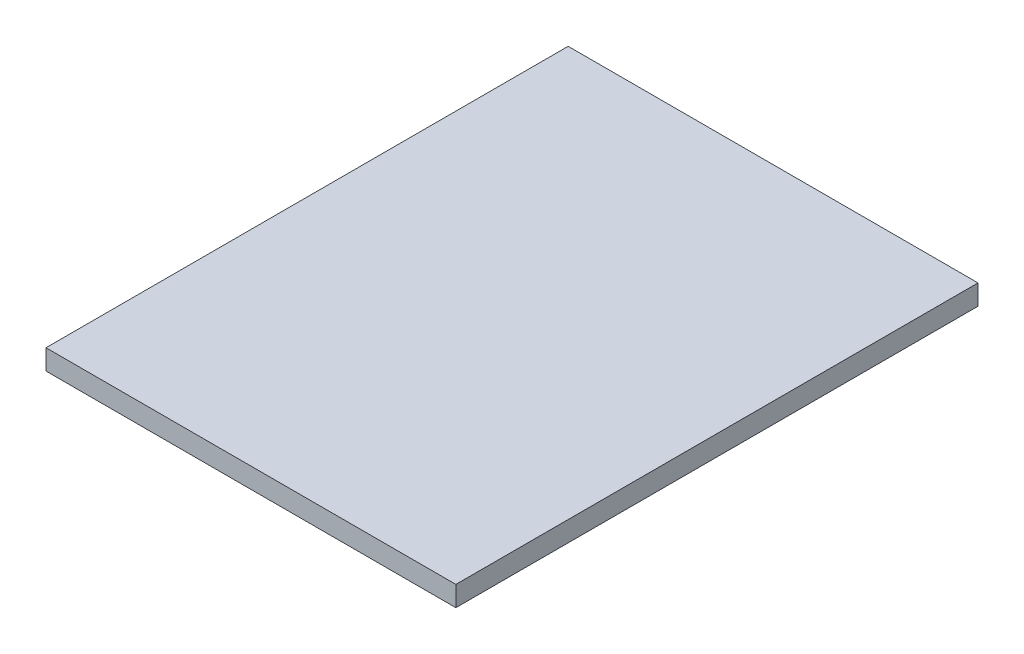
ISO-10303-21;
HEADER;
FILE_DESCRIPTION(('STEP AP214'),'2;1');
FILE_NAME('part.step','',(''),(''),'','','');
FILE_SCHEMA(('AUTOMOTIVE_DESIGN { 1 0 10303 214 1 1 1 1 }'));
ENDSEC;
DATA;
#1=APPLICATION_CONTEXT('core data for automotive mechanical design processes');
#2=APPLICATION_PROTOCOL_DEFINITION('international standard','automotive_design',2000,#1);
#3=PRODUCT_CONTEXT('',#1,'mechanical');
#4=PRODUCT('Part','Part','',(#3));
#5=PRODUCT_RELATED_PRODUCT_CATEGORY('part','',(#4));
#6=PRODUCT_DEFINITION_FORMATION('','',#4);
#7=PRODUCT_DEFINITION_CONTEXT('part definition',#1,'design');
#8=PRODUCT_DEFINITION('design','',#6,#7);
#9=PRODUCT_DEFINITION_SHAPE('','',#8);
#10=(LENGTH_UNIT() NAMED_UNIT(*) SI_UNIT(.MILLI.,.METRE.));
#11=(NAMED_UNIT(*) PLANE_ANGLE_UNIT() SI_UNIT($,.RADIAN.));
#12=(NAMED_UNIT(*) SI_UNIT($,.STERADIAN.) SOLID_ANGLE_UNIT());
#13=UNCERTAINTY_MEASURE_WITH_UNIT(LENGTH_MEASURE(1.E-05),#10,'distance_accuracy_value','');
#14=(GEOMETRIC_REPRESENTATION_CONTEXT(3) GLOBAL_UNCERTAINTY_ASSIGNED_CONTEXT((#13)) GLOBAL_UNIT_ASSIGNED_CONTEXT((#10,
#11,#12)) REPRESENTATION_CONTEXT('',''));
#15=CARTESIAN_POINT('',(0.,0.,0.));
#16=DIRECTION('',(0.,0.,1.));
#17=DIRECTION('',(1.,0.,0.));
#18=AXIS2_PLACEMENT_3D('',#15,#16,#17);
#19=CARTESIAN_POINT('',(213.571580902468,18.,-70.2335563106517));
#20=DIRECTION('',(-1.,0.,0.));
#21=DIRECTION('',(0.,0.,1.));
#22=AXIS2_PLACEMENT_3D('',#19,#20,#21);
#23=PLANE('',#22);
#24=DIRECTION('',(0.,0.,-1.));
#25=VECTOR('',#24,1.);
#26=CARTESIAN_POINT('',(213.571580902468,0.,-70.2335563106517));
#27=LINE('',#26,#25);
#28=CARTESIAN_POINT('',(213.571580902468,0.,394.766443689348));
#29=VERTEX_POINT('',#28);
#30=CARTESIAN_POINT('',(213.571580902468,0.,-70.2335563106517));
#31=VERTEX_POINT('',#30);
#32=EDGE_CURVE('E100',#29,#31,#27,.T.);
#33=ORIENTED_EDGE('',*,*,#32,.T.);
#34=DIRECTION('',(0.,-1.,0.));
#35=VECTOR('',#34,1.);
#36=CARTESIAN_POINT('',(213.571580902468,18.,-70.2335563106517));
#37=LINE('',#36,#35);
#38=CARTESIAN_POINT('',(213.571580902468,18.,-70.2335563106517));
#39=VERTEX_POINT('',#38);
#40=EDGE_CURVE('E11',#39,#31,#37,.T.);
#41=ORIENTED_EDGE('',*,*,#40,.F.);
#42=DIRECTION('',(0.,0.,-1.));
#43=VECTOR('',#42,1.);
#44=CARTESIAN_POINT('',(213.571580902468,18.,-70.2335563106517));
#45=LINE('',#44,#43);
#46=CARTESIAN_POINT('',(213.571580902468,18.,394.766443689348));
#47=VERTEX_POINT('',#46);
#48=EDGE_CURVE('E88',#47,#39,#45,.T.);
#49=ORIENTED_EDGE('',*,*,#48,.F.);
#50=DIRECTION('',(0.,-1.,0.));
#51=VECTOR('',#50,1.);
#52=CARTESIAN_POINT('',(213.571580902468,18.,394.766443689348));
#53=LINE('',#52,#51);
#54=EDGE_CURVE('E96',#47,#29,#53,.T.);
#55=ORIENTED_EDGE('',*,*,#54,.T.);
#56=EDGE_LOOP('',(#33,#41,#49,#55));
#57=FACE_BOUND('',#56,.T.);
#58=ADVANCED_FACE('F37',(#57),#23,.F.);
#59=CARTESIAN_POINT('',(-151.428419097532,18.,-70.2335563106517));
#60=DIRECTION('',(0.,0.,1.));
#61=DIRECTION('',(1.,0.,0.));
#62=AXIS2_PLACEMENT_3D('',#59,#60,#61);
#63=PLANE('',#62);
#64=DIRECTION('',(-1.,0.,0.));
#65=VECTOR('',#64,1.);
#66=CARTESIAN_POINT('',(-151.428419097532,0.,-70.2335563106517));
#67=LINE('',#66,#65);
#68=CARTESIAN_POINT('',(-151.428419097532,0.,-70.2335563106517));
#69=VERTEX_POINT('',#68);
#70=EDGE_CURVE('E92',#31,#69,#67,.T.);
#71=ORIENTED_EDGE('',*,*,#70,.T.);
#72=DIRECTION('',(0.,-1.,0.));
#73=VECTOR('',#72,1.);
#74=CARTESIAN_POINT('',(-151.428419097532,18.,-70.2335563106517));
#75=LINE('',#74,#73);
#76=CARTESIAN_POINT('',(-151.428419097532,18.,-70.2335563106517));
#77=VERTEX_POINT('',#76);
#78=EDGE_CURVE('E45',#77,#69,#75,.T.);
#79=ORIENTED_EDGE('',*,*,#78,.F.);
#80=DIRECTION('',(-1.,0.,0.));
#81=VECTOR('',#80,1.);
#82=CARTESIAN_POINT('',(-151.428419097532,18.,-70.2335563106517));
#83=LINE('',#82,#81);
#84=EDGE_CURVE('E83',#39,#77,#83,.T.);
#85=ORIENTED_EDGE('',*,*,#84,.F.);
#86=ORIENTED_EDGE('',*,*,#40,.T.);
#87=EDGE_LOOP('',(#71,#79,#85,#86));
#88=FACE_BOUND('',#87,.T.);
#89=ADVANCED_FACE('F91',(#88),#63,.F.);
#90=CARTESIAN_POINT('',(-151.428419097532,18.,-70.2335563106517));
#91=DIRECTION('',(1.,0.,0.));
#92=DIRECTION('',(0.,0.,-1.));
#93=AXIS2_PLACEMENT_3D('',#90,#91,#92);
#94=PLANE('',#93);
#95=DIRECTION('',(0.,0.,1.));
#96=VECTOR('',#95,1.);
#97=CARTESIAN_POINT('',(-151.428419097532,0.,-70.2335563106517));
#98=LINE('',#97,#96);
#99=CARTESIAN_POINT('',(-151.428419097532,0.,394.766443689348));
#100=VERTEX_POINT('',#99);
#101=EDGE_CURVE('E70',#69,#100,#98,.T.);
#102=ORIENTED_EDGE('',*,*,#101,.T.);
#103=DIRECTION('',(0.,-1.,0.));
#104=VECTOR('',#103,1.);
#105=CARTESIAN_POINT('',(-151.428419097532,18.,394.766443689348));
#106=LINE('',#105,#104);
#107=CARTESIAN_POINT('',(-151.428419097532,18.,394.766443689348));
#108=VERTEX_POINT('',#107);
#109=EDGE_CURVE('E93',#108,#100,#106,.T.);
#110=ORIENTED_EDGE('',*,*,#109,.F.);
#111=DIRECTION('',(0.,0.,1.));
#112=VECTOR('',#111,1.);
#113=CARTESIAN_POINT('',(-151.428419097532,18.,-70.2335563106517));
#114=LINE('',#113,#112);
#115=EDGE_CURVE('E86',#77,#108,#114,.T.);
#116=ORIENTED_EDGE('',*,*,#115,.F.);
#117=ORIENTED_EDGE('',*,*,#78,.T.);
#118=EDGE_LOOP('',(#102,#110,#116,#117));
#119=FACE_BOUND('',#118,.T.);
#120=ADVANCED_FACE('F94',(#119),#94,.F.);
#121=CARTESIAN_POINT('',(-151.428419097532,18.,394.766443689348));
#122=DIRECTION('',(0.,0.,-1.));
#123=DIRECTION('',(-1.,0.,0.));
#124=AXIS2_PLACEMENT_3D('',#121,#122,#123);
#125=PLANE('',#124);
#126=DIRECTION('',(1.,0.,0.));
#127=VECTOR('',#126,1.);
#128=CARTESIAN_POINT('',(-151.428419097532,0.,394.766443689348));
#129=LINE('',#128,#127);
#130=EDGE_CURVE('E76',#100,#29,#129,.T.);
#131=ORIENTED_EDGE('',*,*,#130,.T.);
#132=ORIENTED_EDGE('',*,*,#54,.F.);
#133=DIRECTION('',(1.,0.,0.));
#134=VECTOR('',#133,1.);
#135=CARTESIAN_POINT('',(-151.428419097532,18.,394.766443689348));
#136=LINE('',#135,#134);
#137=EDGE_CURVE('E53',#108,#47,#136,.T.);
#138=ORIENTED_EDGE('',*,*,#137,.F.);
#139=ORIENTED_EDGE('',*,*,#109,.T.);
#140=EDGE_LOOP('',(#131,#132,#138,#139));
#141=FACE_BOUND('',#140,.T.);
#142=ADVANCED_FACE('F107',(#141),#125,.F.);
#143=CARTESIAN_POINT('',(0.,18.,0.));
#144=DIRECTION('',(0.,1.,0.));
#145=DIRECTION('',(0.,0.,1.));
#146=AXIS2_PLACEMENT_3D('',#143,#144,#145);
#147=PLANE('',#146);
#148=ORIENTED_EDGE('',*,*,#48,.T.);
#149=ORIENTED_EDGE('',*,*,#84,.T.);
#150=ORIENTED_EDGE('',*,*,#115,.T.);
#151=ORIENTED_EDGE('',*,*,#137,.T.);
#152=EDGE_LOOP('',(#148,#149,#150,#151));
#153=FACE_BOUND('',#152,.T.);
#154=ADVANCED_FACE('F84',(#153),#147,.T.);
#155=CARTESIAN_POINT('',(0.,0.,0.));
#156=DIRECTION('',(0.,1.,0.));
#157=DIRECTION('',(0.,0.,1.));
#158=AXIS2_PLACEMENT_3D('',#155,#156,#157);
#159=PLANE('',#158);
#160=ORIENTED_EDGE('',*,*,#32,.F.);
#161=ORIENTED_EDGE('',*,*,#130,.F.);
#162=ORIENTED_EDGE('',*,*,#101,.F.);
#163=ORIENTED_EDGE('',*,*,#70,.F.);
#164=EDGE_LOOP('',(#160,#161,#162,#163));
#165=FACE_BOUND('',#164,.T.);
#166=ADVANCED_FACE('F110',(#165),#159,.F.);
#167=CLOSED_SHELL('',(#58,#89,#120,#142,#154,#166));
#168=MANIFOLD_SOLID_BREP('B2',#167);
#169=ADVANCED_BREP_SHAPE_REPRESENTATION('',(#18,#168),#14);
#170=SHAPE_DEFINITION_REPRESENTATION(#9,#169);
ENDSEC;
END-ISO-10303-21;
